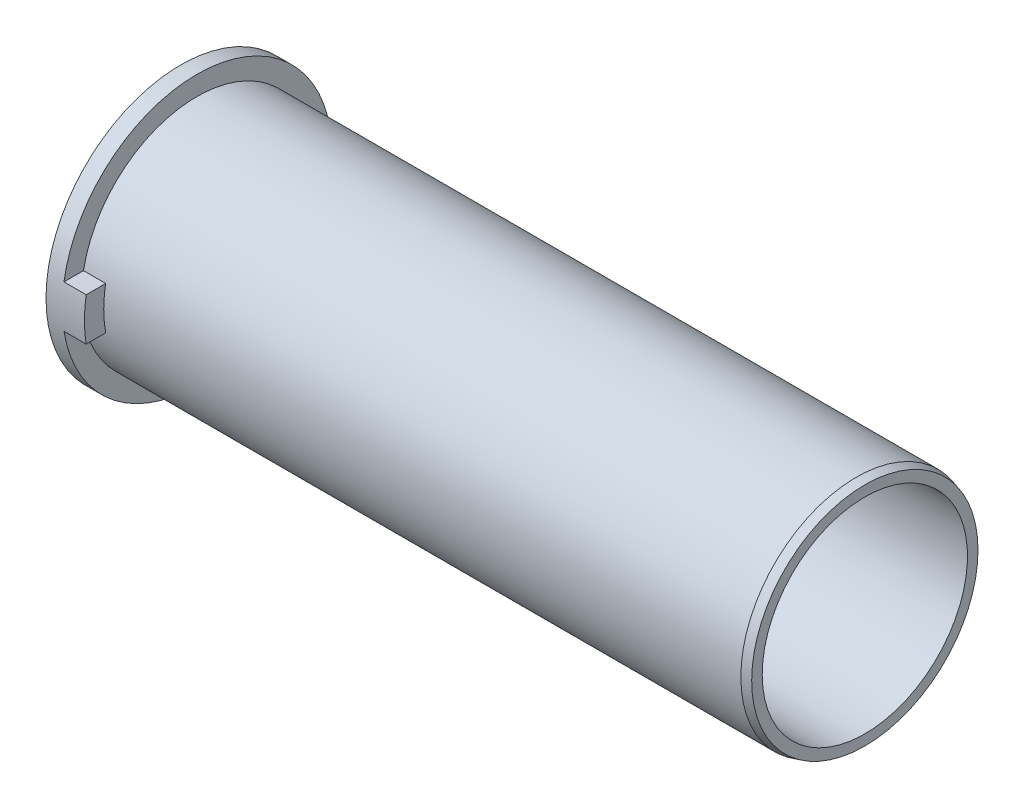
ISO-10303-21;
HEADER;
FILE_DESCRIPTION(('STEP AP214'),'2;1');
FILE_NAME('part.step','',(''),(''),'','','');
FILE_SCHEMA(('AUTOMOTIVE_DESIGN { 1 0 10303 214 1 1 1 1 }'));
ENDSEC;
DATA;
#1=APPLICATION_CONTEXT('core data for automotive mechanical design processes');
#2=APPLICATION_PROTOCOL_DEFINITION('international standard','automotive_design',2000,#1);
#3=PRODUCT_CONTEXT('',#1,'mechanical');
#4=PRODUCT('Part','Part','',(#3));
#5=PRODUCT_RELATED_PRODUCT_CATEGORY('part','',(#4));
#6=PRODUCT_DEFINITION_FORMATION('','',#4);
#7=PRODUCT_DEFINITION_CONTEXT('part definition',#1,'design');
#8=PRODUCT_DEFINITION('design','',#6,#7);
#9=PRODUCT_DEFINITION_SHAPE('','',#8);
#10=(LENGTH_UNIT() NAMED_UNIT(*) SI_UNIT(.MILLI.,.METRE.));
#11=(NAMED_UNIT(*) PLANE_ANGLE_UNIT() SI_UNIT($,.RADIAN.));
#12=(NAMED_UNIT(*) SI_UNIT($,.STERADIAN.) SOLID_ANGLE_UNIT());
#13=UNCERTAINTY_MEASURE_WITH_UNIT(LENGTH_MEASURE(1.E-05),#10,'distance_accuracy_value','');
#14=(GEOMETRIC_REPRESENTATION_CONTEXT(3) GLOBAL_UNCERTAINTY_ASSIGNED_CONTEXT((#13)) GLOBAL_UNIT_ASSIGNED_CONTEXT((#10,
#11,#12)) REPRESENTATION_CONTEXT('',''));
#15=CARTESIAN_POINT('',(0.,0.,0.));
#16=DIRECTION('',(0.,0.,1.));
#17=DIRECTION('',(1.,0.,0.));
#18=AXIS2_PLACEMENT_3D('',#15,#16,#17);
#19=CARTESIAN_POINT('',(0.38,3.15,0.));
#20=DIRECTION('',(-1.,0.,0.));
#21=DIRECTION('',(0.,0.,1.));
#22=AXIS2_PLACEMENT_3D('',#19,#20,#21);
#23=PLANE('',#22);
#24=DIRECTION('',(0.,0.,-1.));
#25=VECTOR('',#24,1.);
#26=CARTESIAN_POINT('',(0.38,-0.5,3.1100643080168));
#27=LINE('',#26,#25);
#28=CARTESIAN_POINT('',(0.38,-0.5,3.1100643080168));
#29=VERTEX_POINT('',#28);
#30=CARTESIAN_POINT('',(0.38,-0.5,2.65329983228432));
#31=VERTEX_POINT('',#30);
#32=EDGE_CURVE('E362',#29,#31,#27,.T.);
#33=ORIENTED_EDGE('',*,*,#32,.F.);
#34=CARTESIAN_POINT('',(0.38,0.,0.));
#35=DIRECTION('',(-1.,0.,0.));
#36=DIRECTION('',(0.,0.,1.));
#37=AXIS2_PLACEMENT_3D('',#34,#35,#36);
#38=CIRCLE('',#37,3.15);
#39=CARTESIAN_POINT('',(0.38,-0.5,-3.1100643080168));
#40=VERTEX_POINT('',#39);
#41=EDGE_CURVE('E121',#40,#29,#38,.T.);
#42=ORIENTED_EDGE('',*,*,#41,.F.);
#43=DIRECTION('',(0.,0.,-1.));
#44=VECTOR('',#43,1.);
#45=CARTESIAN_POINT('',(0.38,-0.5,-2.65329983228432));
#46=LINE('',#45,#44);
#47=CARTESIAN_POINT('',(0.38,-0.5,-2.65329983228432));
#48=VERTEX_POINT('',#47);
#49=EDGE_CURVE('E124',#48,#40,#46,.T.);
#50=ORIENTED_EDGE('',*,*,#49,.F.);
#51=CARTESIAN_POINT('',(0.38,0.,0.));
#52=DIRECTION('',(-1.,0.,0.));
#53=DIRECTION('',(0.,0.,1.));
#54=AXIS2_PLACEMENT_3D('',#51,#52,#53);
#55=CIRCLE('',#54,2.7);
#56=EDGE_CURVE('E152',#48,#31,#55,.T.);
#57=ORIENTED_EDGE('',*,*,#56,.T.);
#58=EDGE_LOOP('',(#33,#42,#50,#57));
#59=FACE_BOUND('',#58,.T.);
#60=ADVANCED_FACE('F33',(#59),#23,.F.);
#61=DIRECTION('',(0.,0.,1.));
#62=VECTOR('',#61,1.);
#63=CARTESIAN_POINT('',(0.38,0.5,3.1100643080168));
#64=LINE('',#63,#62);
#65=CARTESIAN_POINT('',(0.38,0.5,2.65329983228432));
#66=VERTEX_POINT('',#65);
#67=CARTESIAN_POINT('',(0.38,0.5,3.1100643080168));
#68=VERTEX_POINT('',#67);
#69=EDGE_CURVE('E115',#66,#68,#64,.T.);
#70=ORIENTED_EDGE('',*,*,#69,.F.);
#71=CARTESIAN_POINT('',(0.38,0.499999999999999,-2.65329983228432));
#72=VERTEX_POINT('',#71);
#73=EDGE_CURVE('E151',#66,#72,#55,.T.);
#74=ORIENTED_EDGE('',*,*,#73,.T.);
#75=DIRECTION('',(0.,0.,1.));
#76=VECTOR('',#75,1.);
#77=CARTESIAN_POINT('',(0.38,0.5,-2.65329983228432));
#78=LINE('',#77,#76);
#79=CARTESIAN_POINT('',(0.38,0.5,-3.1100643080168));
#80=VERTEX_POINT('',#79);
#81=EDGE_CURVE('E122',#80,#72,#78,.T.);
#82=ORIENTED_EDGE('',*,*,#81,.F.);
#83=EDGE_CURVE('E155',#68,#80,#38,.T.);
#84=ORIENTED_EDGE('',*,*,#83,.F.);
#85=EDGE_LOOP('',(#70,#74,#82,#84));
#86=FACE_BOUND('',#85,.T.);
#87=ADVANCED_FACE('F226',(#86),#23,.F.);
#88=CARTESIAN_POINT('',(0.,0.,0.));
#89=DIRECTION('',(-1.,0.,0.));
#90=DIRECTION('',(0.,0.,1.));
#91=AXIS2_PLACEMENT_3D('',#88,#89,#90);
#92=CYLINDRICAL_SURFACE('',#91,2.7);
#93=CARTESIAN_POINT('',(15.8,0.,0.));
#94=DIRECTION('',(-1.,0.,0.));
#95=DIRECTION('',(0.,0.,1.));
#96=AXIS2_PLACEMENT_3D('',#93,#94,#95);
#97=CIRCLE('',#96,2.7);
#98=CARTESIAN_POINT('',(15.8,0.,2.7));
#99=VERTEX_POINT('',#98);
#100=EDGE_CURVE('E148',#99,#99,#97,.T.);
#101=ORIENTED_EDGE('',*,*,#100,.T.);
#102=EDGE_LOOP('',(#101));
#103=FACE_BOUND('',#102,.T.);
#104=DIRECTION('',(-1.,0.,0.));
#105=VECTOR('',#104,1.);
#106=CARTESIAN_POINT('',(0.9,-0.5,2.65329983228432));
#107=LINE('',#106,#105);
#108=CARTESIAN_POINT('',(0.9,-0.5,2.65329983228432));
#109=VERTEX_POINT('',#108);
#110=EDGE_CURVE('E106',#109,#31,#107,.T.);
#111=ORIENTED_EDGE('',*,*,#110,.T.);
#112=ORIENTED_EDGE('',*,*,#56,.F.);
#113=DIRECTION('',(-1.,0.,0.));
#114=VECTOR('',#113,1.);
#115=CARTESIAN_POINT('',(0.9,-0.5,-2.65329983228432));
#116=LINE('',#115,#114);
#117=CARTESIAN_POINT('',(0.9,-0.5,-2.65329983228432));
#118=VERTEX_POINT('',#117);
#119=EDGE_CURVE('E142',#118,#48,#116,.T.);
#120=ORIENTED_EDGE('',*,*,#119,.F.);
#121=CARTESIAN_POINT('',(0.9,0.,0.));
#122=DIRECTION('',(-1.,0.,0.));
#123=DIRECTION('',(0.,0.,-1.));
#124=AXIS2_PLACEMENT_3D('',#121,#122,#123);
#125=CIRCLE('',#124,2.7);
#126=CARTESIAN_POINT('',(0.9,0.5,-2.65329983228432));
#127=VERTEX_POINT('',#126);
#128=EDGE_CURVE('E135',#127,#118,#125,.T.);
#129=ORIENTED_EDGE('',*,*,#128,.F.);
#130=DIRECTION('',(-1.,0.,0.));
#131=VECTOR('',#130,1.);
#132=CARTESIAN_POINT('',(0.9,0.499999999999999,-2.65329983228432));
#133=LINE('',#132,#131);
#134=EDGE_CURVE('E56',#127,#72,#133,.T.);
#135=ORIENTED_EDGE('',*,*,#134,.T.);
#136=ORIENTED_EDGE('',*,*,#73,.F.);
#137=DIRECTION('',(-1.,0.,0.));
#138=VECTOR('',#137,1.);
#139=CARTESIAN_POINT('',(0.9,0.5,2.65329983228432));
#140=LINE('',#139,#138);
#141=CARTESIAN_POINT('',(0.9,0.5,2.65329983228432));
#142=VERTEX_POINT('',#141);
#143=EDGE_CURVE('E126',#142,#66,#140,.T.);
#144=ORIENTED_EDGE('',*,*,#143,.F.);
#145=CARTESIAN_POINT('',(0.9,0.,0.));
#146=DIRECTION('',(-1.,0.,0.));
#147=DIRECTION('',(0.,0.,-1.));
#148=AXIS2_PLACEMENT_3D('',#145,#146,#147);
#149=CIRCLE('',#148,2.7);
#150=EDGE_CURVE('E109',#109,#142,#149,.T.);
#151=ORIENTED_EDGE('',*,*,#150,.F.);
#152=EDGE_LOOP('',(#111,#112,#120,#129,#135,#136,#144,#151));
#153=FACE_BOUND('',#152,.T.);
#154=ADVANCED_FACE('F231',(#103,#153),#92,.T.);
#155=CARTESIAN_POINT('',(16.,0.,0.));
#156=DIRECTION('',(-1.,0.,0.));
#157=DIRECTION('',(0.,0.,1.));
#158=AXIS2_PLACEMENT_3D('',#155,#156,#157);
#159=CONICAL_SURFACE('',#158,2.64641016151378,0.261799387799149);
#160=ORIENTED_EDGE('',*,*,#100,.F.);
#161=EDGE_LOOP('',(#160));
#162=FACE_BOUND('',#161,.T.);
#163=CARTESIAN_POINT('',(16.,0.,0.));
#164=DIRECTION('',(-1.,0.,0.));
#165=DIRECTION('',(0.,0.,1.));
#166=AXIS2_PLACEMENT_3D('',#163,#164,#165);
#167=CIRCLE('',#166,2.64641016151378);
#168=CARTESIAN_POINT('',(16.,0.,2.64641016151378));
#169=VERTEX_POINT('',#168);
#170=EDGE_CURVE('E11',#169,#169,#167,.T.);
#171=ORIENTED_EDGE('',*,*,#170,.T.);
#172=EDGE_LOOP('',(#171));
#173=FACE_BOUND('',#172,.T.);
#174=ADVANCED_FACE('F35',(#162,#173),#159,.T.);
#175=CARTESIAN_POINT('',(16.,2.64641016151378,0.));
#176=DIRECTION('',(-1.,0.,0.));
#177=DIRECTION('',(0.,0.,1.));
#178=AXIS2_PLACEMENT_3D('',#175,#176,#177);
#179=PLANE('',#178);
#180=ORIENTED_EDGE('',*,*,#170,.F.);
#181=EDGE_LOOP('',(#180));
#182=FACE_BOUND('',#181,.T.);
#183=CARTESIAN_POINT('',(16.,0.,0.));
#184=DIRECTION('',(-1.,0.,0.));
#185=DIRECTION('',(0.,0.,1.));
#186=AXIS2_PLACEMENT_3D('',#183,#184,#185);
#187=CIRCLE('',#186,2.4);
#188=CARTESIAN_POINT('',(16.,0.,2.4));
#189=VERTEX_POINT('',#188);
#190=EDGE_CURVE('E41',#189,#189,#187,.T.);
#191=ORIENTED_EDGE('',*,*,#190,.T.);
#192=EDGE_LOOP('',(#191));
#193=FACE_BOUND('',#192,.T.);
#194=ADVANCED_FACE('F177',(#182,#193),#179,.F.);
#195=CARTESIAN_POINT('',(4.10042017548519,0.,0.));
#196=DIRECTION('',(1.,0.,0.));
#197=DIRECTION('',(0.,0.,-1.));
#198=AXIS2_PLACEMENT_3D('',#195,#196,#197);
#199=CONICAL_SURFACE('',#198,2.3,0.0084034602503165);
#200=ORIENTED_EDGE('',*,*,#190,.F.);
#201=EDGE_LOOP('',(#200));
#202=FACE_BOUND('',#201,.T.);
#203=CARTESIAN_POINT('',(4.10042017548519,0.,0.));
#204=DIRECTION('',(-1.,0.,0.));
#205=DIRECTION('',(0.,0.,1.));
#206=AXIS2_PLACEMENT_3D('',#203,#204,#205);
#207=CIRCLE('',#206,2.3);
#208=CARTESIAN_POINT('',(4.10042017548519,0.,2.3));
#209=VERTEX_POINT('',#208);
#210=EDGE_CURVE('E172',#209,#209,#207,.T.);
#211=ORIENTED_EDGE('',*,*,#210,.T.);
#212=EDGE_LOOP('',(#211));
#213=FACE_BOUND('',#212,.T.);
#214=ADVANCED_FACE('F179',(#202,#213),#199,.F.);
#215=CARTESIAN_POINT('',(4.10042017548519,1.8,0.));
#216=DIRECTION('',(-1.,0.,0.));
#217=DIRECTION('',(0.,0.,1.));
#218=AXIS2_PLACEMENT_3D('',#215,#216,#217);
#219=PLANE('',#218);
#220=ORIENTED_EDGE('',*,*,#210,.F.);
#221=EDGE_LOOP('',(#220));
#222=FACE_BOUND('',#221,.T.);
#223=CARTESIAN_POINT('',(4.10042017548519,0.,0.));
#224=DIRECTION('',(-1.,0.,0.));
#225=DIRECTION('',(0.,0.,1.));
#226=AXIS2_PLACEMENT_3D('',#223,#224,#225);
#227=CIRCLE('',#226,1.8);
#228=CARTESIAN_POINT('',(4.10042017548519,0.,1.8));
#229=VERTEX_POINT('',#228);
#230=EDGE_CURVE('E169',#229,#229,#227,.T.);
#231=ORIENTED_EDGE('',*,*,#230,.T.);
#232=EDGE_LOOP('',(#231));
#233=FACE_BOUND('',#232,.T.);
#234=ADVANCED_FACE('F182',(#222,#233),#219,.F.);
#235=CARTESIAN_POINT('',(0.,0.,0.));
#236=DIRECTION('',(-1.,0.,0.));
#237=DIRECTION('',(0.,0.,1.));
#238=AXIS2_PLACEMENT_3D('',#235,#236,#237);
#239=CYLINDRICAL_SURFACE('',#238,1.8);
#240=ORIENTED_EDGE('',*,*,#230,.F.);
#241=EDGE_LOOP('',(#240));
#242=FACE_BOUND('',#241,.T.);
#243=CARTESIAN_POINT('',(3.67,0.,0.));
#244=DIRECTION('',(-1.,0.,0.));
#245=DIRECTION('',(0.,0.,1.));
#246=AXIS2_PLACEMENT_3D('',#243,#244,#245);
#247=CIRCLE('',#246,1.8);
#248=CARTESIAN_POINT('',(3.67,0.,1.8));
#249=VERTEX_POINT('',#248);
#250=EDGE_CURVE('E166',#249,#249,#247,.T.);
#251=ORIENTED_EDGE('',*,*,#250,.T.);
#252=EDGE_LOOP('',(#251));
#253=FACE_BOUND('',#252,.T.);
#254=ADVANCED_FACE('F188',(#242,#253),#239,.F.);
#255=CARTESIAN_POINT('',(3.67,2.3,0.));
#256=DIRECTION('',(1.,0.,0.));
#257=DIRECTION('',(0.,0.,-1.));
#258=AXIS2_PLACEMENT_3D('',#255,#256,#257);
#259=PLANE('',#258);
#260=ORIENTED_EDGE('',*,*,#250,.F.);
#261=EDGE_LOOP('',(#260));
#262=FACE_BOUND('',#261,.T.);
#263=CARTESIAN_POINT('',(3.67,0.,0.));
#264=DIRECTION('',(-1.,0.,0.));
#265=DIRECTION('',(0.,0.,1.));
#266=AXIS2_PLACEMENT_3D('',#263,#264,#265);
#267=CIRCLE('',#266,2.3);
#268=CARTESIAN_POINT('',(3.67,0.,2.3));
#269=VERTEX_POINT('',#268);
#270=EDGE_CURVE('E163',#269,#269,#267,.T.);
#271=ORIENTED_EDGE('',*,*,#270,.T.);
#272=EDGE_LOOP('',(#271));
#273=FACE_BOUND('',#272,.T.);
#274=ADVANCED_FACE('F194',(#262,#273),#259,.F.);
#275=CARTESIAN_POINT('',(0.,0.,0.));
#276=DIRECTION('',(-1.,0.,0.));
#277=DIRECTION('',(0.,0.,1.));
#278=AXIS2_PLACEMENT_3D('',#275,#276,#277);
#279=CYLINDRICAL_SURFACE('',#278,2.3);
#280=ORIENTED_EDGE('',*,*,#270,.F.);
#281=EDGE_LOOP('',(#280));
#282=FACE_BOUND('',#281,.T.);
#283=CARTESIAN_POINT('',(0.,0.,0.));
#284=DIRECTION('',(-1.,0.,0.));
#285=DIRECTION('',(0.,0.,1.));
#286=AXIS2_PLACEMENT_3D('',#283,#284,#285);
#287=CIRCLE('',#286,2.3);
#288=CARTESIAN_POINT('',(0.,0.,2.3));
#289=VERTEX_POINT('',#288);
#290=EDGE_CURVE('E160',#289,#289,#287,.T.);
#291=ORIENTED_EDGE('',*,*,#290,.T.);
#292=EDGE_LOOP('',(#291));
#293=FACE_BOUND('',#292,.T.);
#294=ADVANCED_FACE('F200',(#282,#293),#279,.F.);
#295=CARTESIAN_POINT('',(0.,3.15,0.));
#296=DIRECTION('',(1.,0.,0.));
#297=DIRECTION('',(0.,0.,-1.));
#298=AXIS2_PLACEMENT_3D('',#295,#296,#297);
#299=PLANE('',#298);
#300=ORIENTED_EDGE('',*,*,#290,.F.);
#301=EDGE_LOOP('',(#300));
#302=FACE_BOUND('',#301,.T.);
#303=CARTESIAN_POINT('',(0.,0.,0.));
#304=DIRECTION('',(-1.,0.,0.));
#305=DIRECTION('',(0.,0.,1.));
#306=AXIS2_PLACEMENT_3D('',#303,#304,#305);
#307=CIRCLE('',#306,3.15);
#308=CARTESIAN_POINT('',(0.,0.,3.15));
#309=VERTEX_POINT('',#308);
#310=EDGE_CURVE('E157',#309,#309,#307,.T.);
#311=ORIENTED_EDGE('',*,*,#310,.T.);
#312=EDGE_LOOP('',(#311));
#313=FACE_BOUND('',#312,.T.);
#314=ADVANCED_FACE('F206',(#302,#313),#299,.F.);
#315=CARTESIAN_POINT('',(0.,0.,0.));
#316=DIRECTION('',(-1.,0.,0.));
#317=DIRECTION('',(0.,0.,1.));
#318=AXIS2_PLACEMENT_3D('',#315,#316,#317);
#319=CYLINDRICAL_SURFACE('',#318,3.15);
#320=ORIENTED_EDGE('',*,*,#310,.F.);
#321=EDGE_LOOP('',(#320));
#322=FACE_BOUND('',#321,.T.);
#323=ORIENTED_EDGE('',*,*,#41,.T.);
#324=DIRECTION('',(-1.,0.,0.));
#325=VECTOR('',#324,1.);
#326=CARTESIAN_POINT('',(0.9,-0.5,3.1100643080168));
#327=LINE('',#326,#325);
#328=CARTESIAN_POINT('',(0.9,-0.5,3.1100643080168));
#329=VERTEX_POINT('',#328);
#330=EDGE_CURVE('E103',#329,#29,#327,.T.);
#331=ORIENTED_EDGE('',*,*,#330,.F.);
#332=CARTESIAN_POINT('',(0.9,0.,0.));
#333=DIRECTION('',(1.,0.,0.));
#334=DIRECTION('',(0.,0.,-1.));
#335=AXIS2_PLACEMENT_3D('',#332,#333,#334);
#336=CIRCLE('',#335,3.15);
#337=CARTESIAN_POINT('',(0.9,0.5,3.1100643080168));
#338=VERTEX_POINT('',#337);
#339=EDGE_CURVE('E110',#338,#329,#336,.T.);
#340=ORIENTED_EDGE('',*,*,#339,.F.);
#341=DIRECTION('',(-1.,0.,0.));
#342=VECTOR('',#341,1.);
#343=CARTESIAN_POINT('',(0.9,0.5,3.1100643080168));
#344=LINE('',#343,#342);
#345=EDGE_CURVE('E48',#338,#68,#344,.T.);
#346=ORIENTED_EDGE('',*,*,#345,.T.);
#347=ORIENTED_EDGE('',*,*,#83,.T.);
#348=DIRECTION('',(-1.,0.,0.));
#349=VECTOR('',#348,1.);
#350=CARTESIAN_POINT('',(0.9,0.5,-3.1100643080168));
#351=LINE('',#350,#349);
#352=CARTESIAN_POINT('',(0.9,0.5,-3.1100643080168));
#353=VERTEX_POINT('',#352);
#354=EDGE_CURVE('E145',#353,#80,#351,.T.);
#355=ORIENTED_EDGE('',*,*,#354,.F.);
#356=CARTESIAN_POINT('',(0.9,0.,0.));
#357=DIRECTION('',(1.,0.,0.));
#358=DIRECTION('',(0.,0.,-1.));
#359=AXIS2_PLACEMENT_3D('',#356,#357,#358);
#360=CIRCLE('',#359,3.15);
#361=CARTESIAN_POINT('',(0.9,-0.5,-3.1100643080168));
#362=VERTEX_POINT('',#361);
#363=EDGE_CURVE('E130',#362,#353,#360,.T.);
#364=ORIENTED_EDGE('',*,*,#363,.F.);
#365=DIRECTION('',(-1.,0.,0.));
#366=VECTOR('',#365,1.);
#367=CARTESIAN_POINT('',(0.9,-0.5,-3.1100643080168));
#368=LINE('',#367,#366);
#369=EDGE_CURVE('E138',#362,#40,#368,.T.);
#370=ORIENTED_EDGE('',*,*,#369,.T.);
#371=EDGE_LOOP('',(#323,#331,#340,#346,#347,#355,#364,#370));
#372=FACE_BOUND('',#371,.T.);
#373=ADVANCED_FACE('F118',(#322,#372),#319,.T.);
#374=CARTESIAN_POINT('',(0.9,0.5,-2.65329983228432));
#375=DIRECTION('',(0.,-1.,0.));
#376=DIRECTION('',(0.,0.,-1.));
#377=AXIS2_PLACEMENT_3D('',#374,#375,#376);
#378=PLANE('',#377);
#379=ORIENTED_EDGE('',*,*,#81,.T.);
#380=ORIENTED_EDGE('',*,*,#134,.F.);
#381=DIRECTION('',(0.,0.,1.));
#382=VECTOR('',#381,1.);
#383=CARTESIAN_POINT('',(0.9,0.5,-2.65329983228432));
#384=LINE('',#383,#382);
#385=EDGE_CURVE('E133',#353,#127,#384,.T.);
#386=ORIENTED_EDGE('',*,*,#385,.F.);
#387=ORIENTED_EDGE('',*,*,#354,.T.);
#388=EDGE_LOOP('',(#379,#380,#386,#387));
#389=FACE_BOUND('',#388,.T.);
#390=ADVANCED_FACE('F216',(#389),#378,.F.);
#391=CARTESIAN_POINT('',(0.9,-0.5,-2.65329983228432));
#392=DIRECTION('',(0.,1.,0.));
#393=DIRECTION('',(0.,0.,1.));
#394=AXIS2_PLACEMENT_3D('',#391,#392,#393);
#395=PLANE('',#394);
#396=ORIENTED_EDGE('',*,*,#49,.T.);
#397=ORIENTED_EDGE('',*,*,#369,.F.);
#398=DIRECTION('',(0.,0.,-1.));
#399=VECTOR('',#398,1.);
#400=CARTESIAN_POINT('',(0.9,-0.5,-2.65329983228432));
#401=LINE('',#400,#399);
#402=EDGE_CURVE('E137',#118,#362,#401,.T.);
#403=ORIENTED_EDGE('',*,*,#402,.F.);
#404=ORIENTED_EDGE('',*,*,#119,.T.);
#405=EDGE_LOOP('',(#396,#397,#403,#404));
#406=FACE_BOUND('',#405,.T.);
#407=ADVANCED_FACE('F222',(#406),#395,.F.);
#408=CARTESIAN_POINT('',(0.9,0.,0.));
#409=DIRECTION('',(1.,0.,0.));
#410=DIRECTION('',(0.,0.,-1.));
#411=AXIS2_PLACEMENT_3D('',#408,#409,#410);
#412=PLANE('',#411);
#413=ORIENTED_EDGE('',*,*,#363,.T.);
#414=ORIENTED_EDGE('',*,*,#385,.T.);
#415=ORIENTED_EDGE('',*,*,#128,.T.);
#416=ORIENTED_EDGE('',*,*,#402,.T.);
#417=EDGE_LOOP('',(#413,#414,#415,#416));
#418=FACE_BOUND('',#417,.T.);
#419=ADVANCED_FACE('F239',(#418),#412,.T.);
#420=CARTESIAN_POINT('',(0.9,-0.5,3.1100643080168));
#421=DIRECTION('',(0.,1.,0.));
#422=DIRECTION('',(0.,0.,1.));
#423=AXIS2_PLACEMENT_3D('',#420,#421,#422);
#424=PLANE('',#423);
#425=ORIENTED_EDGE('',*,*,#32,.T.);
#426=ORIENTED_EDGE('',*,*,#110,.F.);
#427=DIRECTION('',(0.,0.,-1.));
#428=VECTOR('',#427,1.);
#429=CARTESIAN_POINT('',(0.9,-0.5,3.1100643080168));
#430=LINE('',#429,#428);
#431=EDGE_CURVE('E99',#329,#109,#430,.T.);
#432=ORIENTED_EDGE('',*,*,#431,.F.);
#433=ORIENTED_EDGE('',*,*,#330,.T.);
#434=EDGE_LOOP('',(#425,#426,#432,#433));
#435=FACE_BOUND('',#434,.T.);
#436=ADVANCED_FACE('F101',(#435),#424,.F.);
#437=CARTESIAN_POINT('',(0.9,0.5,3.1100643080168));
#438=DIRECTION('',(0.,-1.,0.));
#439=DIRECTION('',(0.,0.,-1.));
#440=AXIS2_PLACEMENT_3D('',#437,#438,#439);
#441=PLANE('',#440);
#442=ORIENTED_EDGE('',*,*,#69,.T.);
#443=ORIENTED_EDGE('',*,*,#345,.F.);
#444=DIRECTION('',(0.,0.,1.));
#445=VECTOR('',#444,1.);
#446=CARTESIAN_POINT('',(0.9,0.5,3.1100643080168));
#447=LINE('',#446,#445);
#448=EDGE_CURVE('E114',#142,#338,#447,.T.);
#449=ORIENTED_EDGE('',*,*,#448,.F.);
#450=ORIENTED_EDGE('',*,*,#143,.T.);
#451=EDGE_LOOP('',(#442,#443,#449,#450));
#452=FACE_BOUND('',#451,.T.);
#453=ADVANCED_FACE('F246',(#452),#441,.F.);
#454=CARTESIAN_POINT('',(0.9,0.,0.));
#455=DIRECTION('',(1.,0.,0.));
#456=DIRECTION('',(0.,0.,-1.));
#457=AXIS2_PLACEMENT_3D('',#454,#455,#456);
#458=PLANE('',#457);
#459=ORIENTED_EDGE('',*,*,#339,.T.);
#460=ORIENTED_EDGE('',*,*,#431,.T.);
#461=ORIENTED_EDGE('',*,*,#150,.T.);
#462=ORIENTED_EDGE('',*,*,#448,.T.);
#463=EDGE_LOOP('',(#459,#460,#461,#462));
#464=FACE_BOUND('',#463,.T.);
#465=ADVANCED_FACE('F112',(#464),#458,.T.);
#466=CLOSED_SHELL('',(#60,#87,#154,#174,#194,#214,#234,#254,#274,#294,#314,#373,#390,#407,#419,
#436,#453,#465));
#467=MANIFOLD_SOLID_BREP('B2',#466);
#468=ADVANCED_BREP_SHAPE_REPRESENTATION('',(#18,#467),#14);
#469=SHAPE_DEFINITION_REPRESENTATION(#9,#468);
ENDSEC;
END-ISO-10303-21;
